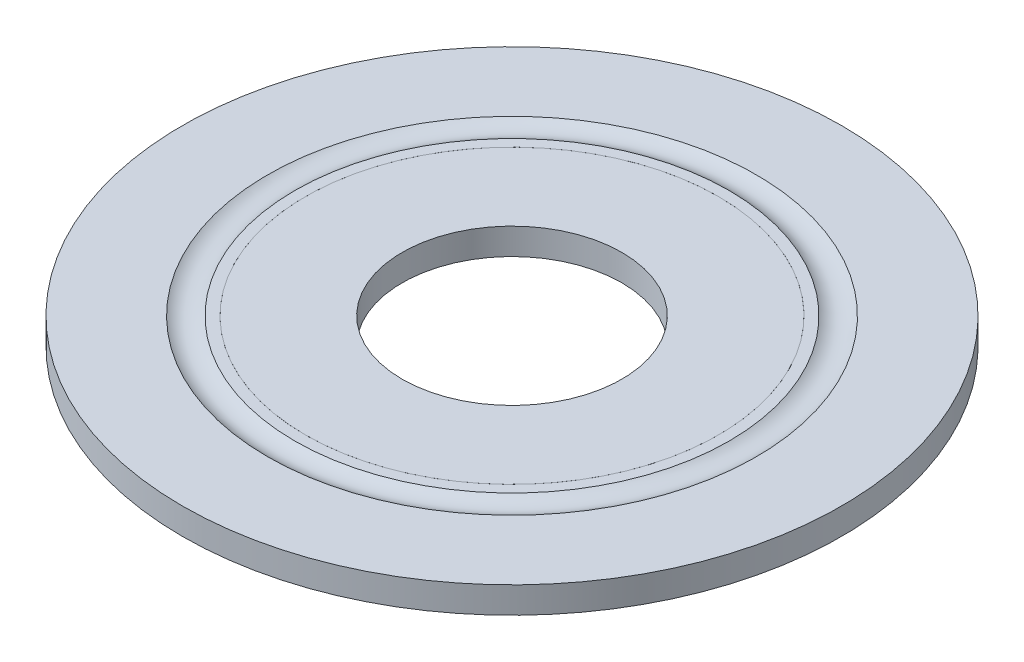
ISO-10303-21;
HEADER;
FILE_DESCRIPTION(('STEP AP214'),'2;1');
FILE_NAME('part.step','',(''),(''),'','','');
FILE_SCHEMA(('AUTOMOTIVE_DESIGN { 1 0 10303 214 1 1 1 1 }'));
ENDSEC;
DATA;
#1=APPLICATION_CONTEXT('core data for automotive mechanical design processes');
#2=APPLICATION_PROTOCOL_DEFINITION('international standard','automotive_design',2000,#1);
#3=PRODUCT_CONTEXT('',#1,'mechanical');
#4=PRODUCT('Part','Part','',(#3));
#5=PRODUCT_RELATED_PRODUCT_CATEGORY('part','',(#4));
#6=PRODUCT_DEFINITION_FORMATION('','',#4);
#7=PRODUCT_DEFINITION_CONTEXT('part definition',#1,'design');
#8=PRODUCT_DEFINITION('design','',#6,#7);
#9=PRODUCT_DEFINITION_SHAPE('','',#8);
#10=(LENGTH_UNIT() NAMED_UNIT(*) SI_UNIT(.MILLI.,.METRE.));
#11=(NAMED_UNIT(*) PLANE_ANGLE_UNIT() SI_UNIT($,.RADIAN.));
#12=(NAMED_UNIT(*) SI_UNIT($,.STERADIAN.) SOLID_ANGLE_UNIT());
#13=UNCERTAINTY_MEASURE_WITH_UNIT(LENGTH_MEASURE(1.E-05),#10,'distance_accuracy_value','');
#14=(GEOMETRIC_REPRESENTATION_CONTEXT(3) GLOBAL_UNCERTAINTY_ASSIGNED_CONTEXT((#13)) GLOBAL_UNIT_ASSIGNED_CONTEXT((#10,
#11,#12)) REPRESENTATION_CONTEXT('',''));
#15=CARTESIAN_POINT('',(0.,0.,0.));
#16=DIRECTION('',(0.,0.,1.));
#17=DIRECTION('',(1.,0.,0.));
#18=AXIS2_PLACEMENT_3D('',#15,#16,#17);
#19=CARTESIAN_POINT('',(59.,0.8724,0.));
#20=DIRECTION('',(0.,-1.,0.));
#21=DIRECTION('',(0.,0.,-1.));
#22=AXIS2_PLACEMENT_3D('',#19,#20,#21);
#23=PLANE('',#22);
#24=CARTESIAN_POINT('',(0.,0.8724,0.));
#25=DIRECTION('',(0.,1.,0.));
#26=DIRECTION('',(0.,0.,1.));
#27=AXIS2_PLACEMENT_3D('',#24,#25,#26);
#28=CIRCLE('',#27,47.);
#29=CARTESIAN_POINT('',(0.,0.8724,47.));
#30=VERTEX_POINT('',#29);
#31=EDGE_CURVE('E52',#30,#30,#28,.T.);
#32=ORIENTED_EDGE('',*,*,#31,.T.);
#33=EDGE_LOOP('',(#32));
#34=FACE_BOUND('',#33,.T.);
#35=CARTESIAN_POINT('',(0.,0.8724,0.));
#36=DIRECTION('',(0.,-1.,0.));
#37=DIRECTION('',(0.,0.,-1.));
#38=AXIS2_PLACEMENT_3D('',#35,#36,#37);
#39=CIRCLE('',#38,75.);
#40=CARTESIAN_POINT('',(0.,0.8724,-75.));
#41=VERTEX_POINT('',#40);
#42=EDGE_CURVE('E61',#41,#41,#39,.T.);
#43=ORIENTED_EDGE('',*,*,#42,.T.);
#44=EDGE_LOOP('',(#43));
#45=FACE_BOUND('',#44,.T.);
#46=ADVANCED_FACE('F41',(#34,#45),#23,.T.);
#47=CARTESIAN_POINT('',(0.,1.8724,0.));
#48=DIRECTION('',(0.,1.,0.));
#49=DIRECTION('',(0.,0.,1.));
#50=AXIS2_PLACEMENT_3D('',#47,#48,#49);
#51=TOROIDAL_SURFACE('',#50,47.,1.);
#52=CARTESIAN_POINT('',(0.,0.872424878980681,0.));
#53=DIRECTION('',(0.,1.,0.));
#54=DIRECTION('',(0.,0.,1.));
#55=AXIS2_PLACEMENT_3D('',#52,#53,#54);
#56=CIRCLE('',#55,46.9929461115406);
#57=CARTESIAN_POINT('',(0.,0.872424878980681,46.9929461115406));
#58=VERTEX_POINT('',#57);
#59=EDGE_CURVE('E11',#58,#58,#56,.F.);
#60=ORIENTED_EDGE('',*,*,#59,.F.);
#61=EDGE_LOOP('',(#60));
#62=FACE_BOUND('',#61,.T.);
#63=ORIENTED_EDGE('',*,*,#31,.F.);
#64=EDGE_LOOP('',(#63));
#65=FACE_BOUND('',#64,.T.);
#66=ADVANCED_FACE('F77',(#62,#65),#51,.T.);
#67=CARTESIAN_POINT('',(0.,5.8724,0.));
#68=DIRECTION('',(0.,1.,0.));
#69=DIRECTION('',(0.,0.,1.));
#70=AXIS2_PLACEMENT_3D('',#67,#68,#69);
#71=CONICAL_SURFACE('',#70,46.,0.785398163397353);
#72=CARTESIAN_POINT('',(0.,6.86534611154079,0.));
#73=DIRECTION('',(0.,1.,0.));
#74=DIRECTION('',(0.,0.,1.));
#75=AXIS2_PLACEMENT_3D('',#72,#73,#74);
#76=CIRCLE('',#75,46.9929461115406);
#77=CARTESIAN_POINT('',(0.,6.86534611154079,46.9929461115406));
#78=VERTEX_POINT('',#77);
#79=EDGE_CURVE('E44',#78,#78,#76,.T.);
#80=ORIENTED_EDGE('',*,*,#79,.F.);
#81=EDGE_LOOP('',(#80));
#82=FACE_BOUND('',#81,.T.);
#83=CARTESIAN_POINT('',(0.,6.87240000000019,0.));
#84=DIRECTION('',(0.,1.,0.));
#85=DIRECTION('',(0.,0.,1.));
#86=AXIS2_PLACEMENT_3D('',#83,#84,#85);
#87=CIRCLE('',#86,47.);
#88=CARTESIAN_POINT('',(0.,6.87240000000019,47.));
#89=VERTEX_POINT('',#88);
#90=EDGE_CURVE('E70',#89,#89,#87,.T.);
#91=ORIENTED_EDGE('',*,*,#90,.T.);
#92=EDGE_LOOP('',(#91));
#93=FACE_BOUND('',#92,.T.);
#94=ADVANCED_FACE('F79',(#82,#93),#71,.F.);
#95=CARTESIAN_POINT('',(47.,6.87240000000009,0.));
#96=DIRECTION('',(0.,1.,0.));
#97=DIRECTION('',(0.,0.,1.));
#98=AXIS2_PLACEMENT_3D('',#95,#96,#97);
#99=PLANE('',#98);
#100=CARTESIAN_POINT('',(0.,6.8724,0.));
#101=DIRECTION('',(0.,1.,0.));
#102=DIRECTION('',(0.,0.,1.));
#103=AXIS2_PLACEMENT_3D('',#100,#101,#102);
#104=CIRCLE('',#103,49.4043);
#105=CARTESIAN_POINT('',(0.,6.8724,49.4043));
#106=VERTEX_POINT('',#105);
#107=EDGE_CURVE('E67',#106,#106,#104,.T.);
#108=ORIENTED_EDGE('',*,*,#107,.T.);
#109=EDGE_LOOP('',(#108));
#110=FACE_BOUND('',#109,.T.);
#111=ORIENTED_EDGE('',*,*,#90,.F.);
#112=EDGE_LOOP('',(#111));
#113=FACE_BOUND('',#112,.T.);
#114=ADVANCED_FACE('F85',(#110,#113),#99,.T.);
#115=CARTESIAN_POINT('',(0.,11.,0.));
#116=DIRECTION('',(0.,1.,0.));
#117=DIRECTION('',(0.,0.,1.));
#118=AXIS2_PLACEMENT_3D('',#115,#116,#117);
#119=TOROIDAL_SURFACE('',#118,52.5,5.15950000000006);
#120=CARTESIAN_POINT('',(0.,6.87239999999989,0.));
#121=DIRECTION('',(0.,1.,0.));
#122=DIRECTION('',(0.,0.,1.));
#123=AXIS2_PLACEMENT_3D('',#120,#121,#122);
#124=CIRCLE('',#123,55.5957);
#125=CARTESIAN_POINT('',(0.,6.87239999999989,55.5957));
#126=VERTEX_POINT('',#125);
#127=EDGE_CURVE('E60',#126,#126,#124,.T.);
#128=ORIENTED_EDGE('',*,*,#127,.T.);
#129=EDGE_LOOP('',(#128));
#130=FACE_BOUND('',#129,.T.);
#131=ORIENTED_EDGE('',*,*,#107,.F.);
#132=EDGE_LOOP('',(#131));
#133=FACE_BOUND('',#132,.T.);
#134=ADVANCED_FACE('F91',(#130,#133),#119,.F.);
#135=CARTESIAN_POINT('',(55.5957,6.87239999999995,0.));
#136=DIRECTION('',(0.,1.,0.));
#137=DIRECTION('',(0.,0.,1.));
#138=AXIS2_PLACEMENT_3D('',#135,#136,#137);
#139=PLANE('',#138);
#140=ORIENTED_EDGE('',*,*,#127,.F.);
#141=EDGE_LOOP('',(#140));
#142=FACE_BOUND('',#141,.T.);
#143=CARTESIAN_POINT('',(0.,6.8724,0.));
#144=DIRECTION('',(0.,-1.,0.));
#145=DIRECTION('',(0.,0.,-1.));
#146=AXIS2_PLACEMENT_3D('',#143,#144,#145);
#147=CIRCLE('',#146,75.);
#148=CARTESIAN_POINT('',(0.,6.8724,-75.));
#149=VERTEX_POINT('',#148);
#150=EDGE_CURVE('E57',#149,#149,#147,.T.);
#151=ORIENTED_EDGE('',*,*,#150,.F.);
#152=EDGE_LOOP('',(#151));
#153=FACE_BOUND('',#152,.T.);
#154=ADVANCED_FACE('F95',(#142,#153),#139,.T.);
#155=CARTESIAN_POINT('',(0.,6.8724,0.));
#156=DIRECTION('',(0.,-1.,0.));
#157=DIRECTION('',(0.,0.,-1.));
#158=AXIS2_PLACEMENT_3D('',#155,#156,#157);
#159=CYLINDRICAL_SURFACE('',#158,75.);
#160=ORIENTED_EDGE('',*,*,#150,.T.);
#161=EDGE_LOOP('',(#160));
#162=FACE_BOUND('',#161,.T.);
#163=ORIENTED_EDGE('',*,*,#42,.F.);
#164=EDGE_LOOP('',(#163));
#165=FACE_BOUND('',#164,.T.);
#166=ADVANCED_FACE('F99',(#162,#165),#159,.T.);
#167=CARTESIAN_POINT('',(0.,6.8724,0.));
#168=DIRECTION('',(0.,-1.,0.));
#169=DIRECTION('',(0.,0.,-1.));
#170=AXIS2_PLACEMENT_3D('',#167,#168,#169);
#171=PLANE('',#170);
#172=CARTESIAN_POINT('',(0.,6.8724,0.));
#173=DIRECTION('',(0.,1.,0.));
#174=DIRECTION('',(0.,0.,1.));
#175=AXIS2_PLACEMENT_3D('',#172,#173,#174);
#176=CIRCLE('',#175,25.);
#177=CARTESIAN_POINT('',(0.,6.8724,25.));
#178=VERTEX_POINT('',#177);
#179=EDGE_CURVE('E128',#178,#178,#176,.T.);
#180=ORIENTED_EDGE('',*,*,#179,.F.);
#181=EDGE_LOOP('',(#180));
#182=FACE_BOUND('',#181,.T.);
#183=CARTESIAN_POINT('',(0.,6.8724,0.));
#184=DIRECTION('',(0.,-1.,0.));
#185=DIRECTION('',(0.,0.,-1.));
#186=AXIS2_PLACEMENT_3D('',#183,#184,#185);
#187=CIRCLE('',#186,46.9929461115406);
#188=CARTESIAN_POINT('',(0.,6.8724,-46.9929461115406));
#189=VERTEX_POINT('',#188);
#190=EDGE_CURVE('E64',#189,#189,#187,.T.);
#191=ORIENTED_EDGE('',*,*,#190,.F.);
#192=EDGE_LOOP('',(#191));
#193=FACE_BOUND('',#192,.T.);
#194=ADVANCED_FACE('F103',(#182,#193),#171,.F.);
#195=CARTESIAN_POINT('',(0.,6.8724,0.));
#196=DIRECTION('',(0.,-1.,0.));
#197=DIRECTION('',(0.,0.,-1.));
#198=AXIS2_PLACEMENT_3D('',#195,#196,#197);
#199=CYLINDRICAL_SURFACE('',#198,46.9929461115406);
#200=ORIENTED_EDGE('',*,*,#79,.T.);
#201=EDGE_LOOP('',(#200));
#202=FACE_BOUND('',#201,.T.);
#203=ORIENTED_EDGE('',*,*,#190,.T.);
#204=EDGE_LOOP('',(#203));
#205=FACE_BOUND('',#204,.T.);
#206=ADVANCED_FACE('F105',(#202,#205),#199,.T.);
#207=ORIENTED_EDGE('',*,*,#59,.T.);
#208=EDGE_LOOP('',(#207));
#209=FACE_BOUND('',#208,.T.);
#210=CARTESIAN_POINT('',(0.,0.8724,0.));
#211=DIRECTION('',(0.,-1.,0.));
#212=DIRECTION('',(0.,0.,-1.));
#213=AXIS2_PLACEMENT_3D('',#210,#211,#212);
#214=CIRCLE('',#213,46.9929461115406);
#215=CARTESIAN_POINT('',(0.,0.8724,-46.9929461115406));
#216=VERTEX_POINT('',#215);
#217=EDGE_CURVE('E55',#216,#216,#214,.T.);
#218=ORIENTED_EDGE('',*,*,#217,.F.);
#219=EDGE_LOOP('',(#218));
#220=FACE_BOUND('',#219,.T.);
#221=ADVANCED_FACE('F108',(#209,#220),#199,.T.);
#222=CARTESIAN_POINT('',(0.,0.8724,0.));
#223=DIRECTION('',(0.,-1.,0.));
#224=DIRECTION('',(0.,0.,-1.));
#225=AXIS2_PLACEMENT_3D('',#222,#223,#224);
#226=PLANE('',#225);
#227=CARTESIAN_POINT('',(0.,0.872400000000001,0.));
#228=DIRECTION('',(0.,1.,0.));
#229=DIRECTION('',(0.,0.,1.));
#230=AXIS2_PLACEMENT_3D('',#227,#228,#229);
#231=CIRCLE('',#230,25.);
#232=CARTESIAN_POINT('',(0.,0.872400000000001,25.));
#233=VERTEX_POINT('',#232);
#234=EDGE_CURVE('E125',#233,#233,#231,.T.);
#235=ORIENTED_EDGE('',*,*,#234,.T.);
#236=EDGE_LOOP('',(#235));
#237=FACE_BOUND('',#236,.T.);
#238=ORIENTED_EDGE('',*,*,#217,.T.);
#239=EDGE_LOOP('',(#238));
#240=FACE_BOUND('',#239,.T.);
#241=ADVANCED_FACE('F110',(#237,#240),#226,.T.);
#242=CARTESIAN_POINT('',(0.,0.872400000000001,0.));
#243=DIRECTION('',(0.,1.,0.));
#244=DIRECTION('',(0.,0.,1.));
#245=AXIS2_PLACEMENT_3D('',#242,#243,#244);
#246=CYLINDRICAL_SURFACE('',#245,25.);
#247=ORIENTED_EDGE('',*,*,#234,.F.);
#248=EDGE_LOOP('',(#247));
#249=FACE_BOUND('',#248,.T.);
#250=ORIENTED_EDGE('',*,*,#179,.T.);
#251=EDGE_LOOP('',(#250));
#252=FACE_BOUND('',#251,.T.);
#253=ADVANCED_FACE('F113',(#249,#252),#246,.F.);
#254=CLOSED_SHELL('',(#46,#66,#94,#114,#134,#154,#166,#194,#206,#221,#241,#253));
#255=MANIFOLD_SOLID_BREP('B2',#254);
#256=ADVANCED_BREP_SHAPE_REPRESENTATION('',(#18,#255),#14);
#257=SHAPE_DEFINITION_REPRESENTATION(#9,#256);
ENDSEC;
END-ISO-10303-21;
